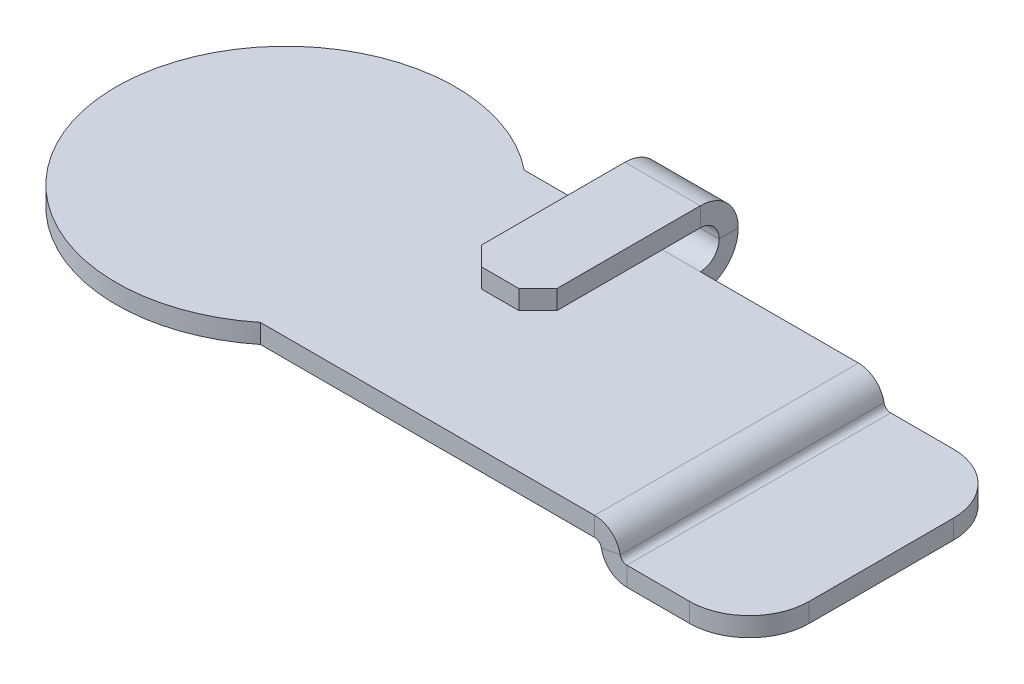
ISO-10303-21;
HEADER;
FILE_DESCRIPTION(('STEP AP214'),'2;1');
FILE_NAME('part.step','',(''),(''),'','','');
FILE_SCHEMA(('AUTOMOTIVE_DESIGN { 1 0 10303 214 1 1 1 1 }'));
ENDSEC;
DATA;
#1=APPLICATION_CONTEXT('core data for automotive mechanical design processes');
#2=APPLICATION_PROTOCOL_DEFINITION('international standard','automotive_design',2000,#1);
#3=PRODUCT_CONTEXT('',#1,'mechanical');
#4=PRODUCT('Part','Part','',(#3));
#5=PRODUCT_RELATED_PRODUCT_CATEGORY('part','',(#4));
#6=PRODUCT_DEFINITION_FORMATION('','',#4);
#7=PRODUCT_DEFINITION_CONTEXT('part definition',#1,'design');
#8=PRODUCT_DEFINITION('design','',#6,#7);
#9=PRODUCT_DEFINITION_SHAPE('','',#8);
#10=(LENGTH_UNIT() NAMED_UNIT(*) SI_UNIT(.MILLI.,.METRE.));
#11=(NAMED_UNIT(*) PLANE_ANGLE_UNIT() SI_UNIT($,.RADIAN.));
#12=(NAMED_UNIT(*) SI_UNIT($,.STERADIAN.) SOLID_ANGLE_UNIT());
#13=UNCERTAINTY_MEASURE_WITH_UNIT(LENGTH_MEASURE(1.E-05),#10,'distance_accuracy_value','');
#14=(GEOMETRIC_REPRESENTATION_CONTEXT(3) GLOBAL_UNCERTAINTY_ASSIGNED_CONTEXT((#13)) GLOBAL_UNIT_ASSIGNED_CONTEXT((#10,
#11,#12)) REPRESENTATION_CONTEXT('',''));
#15=CARTESIAN_POINT('',(0.,0.,0.));
#16=DIRECTION('',(0.,0.,1.));
#17=DIRECTION('',(1.,0.,0.));
#18=AXIS2_PLACEMENT_3D('',#15,#16,#17);
#19=CARTESIAN_POINT('',(0.,0.,-4.508));
#20=DIRECTION('',(0.,0.,-1.));
#21=DIRECTION('',(0.,1.,0.));
#22=AXIS2_PLACEMENT_3D('',#19,#20,#21);
#23=PLANE('',#22);
#24=DIRECTION('',(0.,-1.,0.));
#25=VECTOR('',#24,1.);
#26=CARTESIAN_POINT('',(-2.80312500000001,0.,-4.508));
#27=LINE('',#26,#25);
#28=CARTESIAN_POINT('',(-2.80312500000001,1.008,-4.508));
#29=VERTEX_POINT('',#28);
#30=CARTESIAN_POINT('',(-2.80312500000001,1.01580978479832,-4.508));
#31=VERTEX_POINT('',#30);
#32=EDGE_CURVE('E96',#29,#31,#27,.F.);
#33=ORIENTED_EDGE('',*,*,#32,.T.);
#34=DIRECTION('',(1.,0.,0.));
#35=VECTOR('',#34,1.);
#36=CARTESIAN_POINT('',(0.,1.01580978479832,-4.508));
#37=LINE('',#36,#35);
#38=CARTESIAN_POINT('',(-0.803125000000015,1.01580978479832,-4.508));
#39=VERTEX_POINT('',#38);
#40=EDGE_CURVE('E88',#31,#39,#37,.T.);
#41=ORIENTED_EDGE('',*,*,#40,.T.);
#42=DIRECTION('',(0.,1.,0.));
#43=VECTOR('',#42,1.);
#44=CARTESIAN_POINT('',(-0.803125000000016,0.,-4.508));
#45=LINE('',#44,#43);
#46=CARTESIAN_POINT('',(-0.803125000000015,1.00799999999999,-4.508));
#47=VERTEX_POINT('',#46);
#48=EDGE_CURVE('E104',#39,#47,#45,.F.);
#49=ORIENTED_EDGE('',*,*,#48,.T.);
#50=DIRECTION('',(-1.,0.,0.));
#51=VECTOR('',#50,1.);
#52=CARTESIAN_POINT('',(0.,1.008,-4.508));
#53=LINE('',#52,#51);
#54=EDGE_CURVE('E429',#47,#29,#53,.T.);
#55=ORIENTED_EDGE('',*,*,#54,.T.);
#56=EDGE_LOOP('',(#33,#41,#49,#55));
#57=FACE_BOUND('',#56,.T.);
#58=ADVANCED_FACE('F79',(#57),#23,.T.);
#59=CARTESIAN_POINT('',(7.5,0.508,-3.5));
#60=DIRECTION('',(0.,0.,-1.));
#61=DIRECTION('',(-1.,0.,0.));
#62=AXIS2_PLACEMENT_3D('',#59,#60,#61);
#63=PLANE('',#62);
#64=DIRECTION('',(-1.,0.,0.));
#65=VECTOR('',#64,1.);
#66=CARTESIAN_POINT('',(7.5,0.508,-3.5));
#67=LINE('',#66,#65);
#68=CARTESIAN_POINT('',(3.39388584185377,0.508,-3.5));
#69=VERTEX_POINT('',#68);
#70=CARTESIAN_POINT('',(-0.803125000000015,0.507999999999994,-3.5));
#71=VERTEX_POINT('',#70);
#72=EDGE_CURVE('E450',#69,#71,#67,.T.);
#73=ORIENTED_EDGE('',*,*,#72,.F.);
#74=DIRECTION('',(0.,-1.,0.));
#75=VECTOR('',#74,1.);
#76=CARTESIAN_POINT('',(3.39388584185377,0.508,-3.5));
#77=LINE('',#76,#75);
#78=CARTESIAN_POINT('',(3.39388584185377,0.,-3.5));
#79=VERTEX_POINT('',#78);
#80=EDGE_CURVE('E440',#69,#79,#77,.T.);
#81=ORIENTED_EDGE('',*,*,#80,.T.);
#82=DIRECTION('',(1.,0.,0.));
#83=VECTOR('',#82,1.);
#84=CARTESIAN_POINT('',(0.,0.,-3.5));
#85=LINE('',#84,#83);
#86=CARTESIAN_POINT('',(-0.803125000000015,0.,-3.5));
#87=VERTEX_POINT('',#86);
#88=EDGE_CURVE('E381',#79,#87,#85,.F.);
#89=ORIENTED_EDGE('',*,*,#88,.T.);
#90=DIRECTION('',(0.,-1.,0.));
#91=VECTOR('',#90,1.);
#92=CARTESIAN_POINT('',(-0.803125000000015,0.507999999999994,-3.5));
#93=LINE('',#92,#91);
#94=EDGE_CURVE('E387',#71,#87,#93,.T.);
#95=ORIENTED_EDGE('',*,*,#94,.F.);
#96=EDGE_LOOP('',(#73,#81,#89,#95));
#97=FACE_BOUND('',#96,.T.);
#98=ADVANCED_FACE('F569',(#97),#63,.T.);
#99=CARTESIAN_POINT('',(7.5,0.508,3.5));
#100=DIRECTION('',(0.,0.,1.));
#101=DIRECTION('',(1.,0.,0.));
#102=AXIS2_PLACEMENT_3D('',#99,#100,#101);
#103=PLANE('',#102);
#104=DIRECTION('',(1.,0.,0.));
#105=VECTOR('',#104,1.);
#106=CARTESIAN_POINT('',(0.,0.,3.5));
#107=LINE('',#106,#105);
#108=CARTESIAN_POINT('',(-5.47469787525383,0.,3.5));
#109=VERTEX_POINT('',#108);
#110=CARTESIAN_POINT('',(3.39388584185377,0.,3.5));
#111=VERTEX_POINT('',#110);
#112=EDGE_CURVE('E445',#109,#111,#107,.T.);
#113=ORIENTED_EDGE('',*,*,#112,.T.);
#114=DIRECTION('',(0.,1.,0.));
#115=VECTOR('',#114,1.);
#116=CARTESIAN_POINT('',(3.39388584185377,0.508,3.5));
#117=LINE('',#116,#115);
#118=CARTESIAN_POINT('',(3.39388584185377,0.508,3.5));
#119=VERTEX_POINT('',#118);
#120=EDGE_CURVE('E434',#111,#119,#117,.T.);
#121=ORIENTED_EDGE('',*,*,#120,.T.);
#122=DIRECTION('',(1.,0.,0.));
#123=VECTOR('',#122,1.);
#124=CARTESIAN_POINT('',(7.5,0.508,3.5));
#125=LINE('',#124,#123);
#126=CARTESIAN_POINT('',(-5.47469787525383,0.508,3.5));
#127=VERTEX_POINT('',#126);
#128=EDGE_CURVE('E448',#127,#119,#125,.T.);
#129=ORIENTED_EDGE('',*,*,#128,.F.);
#130=DIRECTION('',(0.,1.,0.));
#131=VECTOR('',#130,1.);
#132=CARTESIAN_POINT('',(-5.47469787525383,0.508,3.5));
#133=LINE('',#132,#131);
#134=EDGE_CURVE('E385',#109,#127,#133,.T.);
#135=ORIENTED_EDGE('',*,*,#134,.F.);
#136=EDGE_LOOP('',(#113,#121,#129,#135));
#137=FACE_BOUND('',#136,.T.);
#138=ADVANCED_FACE('F513',(#137),#103,.T.);
#139=CARTESIAN_POINT('',(0.,0.508,0.));
#140=DIRECTION('',(0.,1.,0.));
#141=DIRECTION('',(0.,0.,1.));
#142=AXIS2_PLACEMENT_3D('',#139,#140,#141);
#143=PLANE('',#142);
#144=ORIENTED_EDGE('',*,*,#128,.T.);
#145=DIRECTION('',(0.,0.,-1.));
#146=VECTOR('',#145,1.);
#147=CARTESIAN_POINT('',(3.39388584185377,0.508,0.));
#148=LINE('',#147,#146);
#149=EDGE_CURVE('E431',#119,#69,#148,.T.);
#150=ORIENTED_EDGE('',*,*,#149,.T.);
#151=ORIENTED_EDGE('',*,*,#72,.T.);
#152=DIRECTION('',(-1.,0.,0.));
#153=VECTOR('',#152,1.);
#154=CARTESIAN_POINT('',(-2.80312500000001,0.507999999999994,-3.5));
#155=LINE('',#154,#153);
#156=CARTESIAN_POINT('',(-2.80312500000001,0.507999999999994,-3.5));
#157=VERTEX_POINT('',#156);
#158=EDGE_CURVE('E411',#157,#71,#155,.F.);
#159=ORIENTED_EDGE('',*,*,#158,.F.);
#160=CARTESIAN_POINT('',(-5.47469787525382,0.508,-3.5));
#161=VERTEX_POINT('',#160);
#162=EDGE_CURVE('E399',#157,#161,#67,.T.);
#163=ORIENTED_EDGE('',*,*,#162,.T.);
#164=CARTESIAN_POINT('',(-8.30312500000002,0.508,0.));
#165=DIRECTION('',(0.,1.,0.));
#166=DIRECTION('',(0.,0.,1.));
#167=AXIS2_PLACEMENT_3D('',#164,#165,#166);
#168=CIRCLE('',#167,4.5);
#169=EDGE_CURVE('E395',#161,#127,#168,.T.);
#170=ORIENTED_EDGE('',*,*,#169,.T.);
#171=EDGE_LOOP('',(#144,#150,#151,#159,#163,#170));
#172=FACE_BOUND('',#171,.T.);
#173=ADVANCED_FACE('F511',(#172),#143,.T.);
#174=CARTESIAN_POINT('',(0.,0.,0.));
#175=DIRECTION('',(0.,1.,0.));
#176=DIRECTION('',(0.,0.,1.));
#177=AXIS2_PLACEMENT_3D('',#174,#175,#176);
#178=PLANE('',#177);
#179=DIRECTION('',(0.,0.,-1.));
#180=VECTOR('',#179,1.);
#181=CARTESIAN_POINT('',(3.39388584185377,0.,0.));
#182=LINE('',#181,#180);
#183=EDGE_CURVE('E437',#111,#79,#182,.T.);
#184=ORIENTED_EDGE('',*,*,#183,.F.);
#185=ORIENTED_EDGE('',*,*,#112,.F.);
#186=CARTESIAN_POINT('',(-8.30312500000002,0.,0.));
#187=DIRECTION('',(0.,1.,0.));
#188=DIRECTION('',(0.,0.,1.));
#189=AXIS2_PLACEMENT_3D('',#186,#187,#188);
#190=CIRCLE('',#189,4.5);
#191=CARTESIAN_POINT('',(-5.47469787525383,0.,-3.5));
#192=VERTEX_POINT('',#191);
#193=EDGE_CURVE('E388',#192,#109,#190,.T.);
#194=ORIENTED_EDGE('',*,*,#193,.F.);
#195=CARTESIAN_POINT('',(-2.80312500000001,0.,-3.5));
#196=VERTEX_POINT('',#195);
#197=EDGE_CURVE('E392',#196,#192,#85,.F.);
#198=ORIENTED_EDGE('',*,*,#197,.F.);
#199=DIRECTION('',(-1.,0.,0.));
#200=VECTOR('',#199,1.);
#201=CARTESIAN_POINT('',(-2.80312500000002,0.,-3.5));
#202=LINE('',#201,#200);
#203=EDGE_CURVE('E398',#196,#87,#202,.F.);
#204=ORIENTED_EDGE('',*,*,#203,.T.);
#205=ORIENTED_EDGE('',*,*,#88,.F.);
#206=EDGE_LOOP('',(#184,#185,#194,#198,#204,#205));
#207=FACE_BOUND('',#206,.T.);
#208=ADVANCED_FACE('F503',(#207),#178,.F.);
#209=ORIENTED_EDGE('',*,*,#162,.F.);
#210=DIRECTION('',(0.,-1.,0.));
#211=VECTOR('',#210,1.);
#212=CARTESIAN_POINT('',(-2.80312500000001,0.507999999999994,-3.5));
#213=LINE('',#212,#211);
#214=EDGE_CURVE('E400',#157,#196,#213,.T.);
#215=ORIENTED_EDGE('',*,*,#214,.T.);
#216=ORIENTED_EDGE('',*,*,#197,.T.);
#217=DIRECTION('',(0.,1.,0.));
#218=VECTOR('',#217,1.);
#219=CARTESIAN_POINT('',(-5.47469787525382,0.508,-3.5));
#220=LINE('',#219,#218);
#221=EDGE_CURVE('E389',#192,#161,#220,.T.);
#222=ORIENTED_EDGE('',*,*,#221,.T.);
#223=EDGE_LOOP('',(#209,#215,#216,#222));
#224=FACE_BOUND('',#223,.T.);
#225=ADVANCED_FACE('F497',(#224),#63,.T.);
#226=CARTESIAN_POINT('',(-8.30312500000002,0.508,0.));
#227=DIRECTION('',(0.,1.,0.));
#228=DIRECTION('',(0.,0.,1.));
#229=AXIS2_PLACEMENT_3D('',#226,#227,#228);
#230=CYLINDRICAL_SURFACE('',#229,4.5);
#231=ORIENTED_EDGE('',*,*,#221,.F.);
#232=ORIENTED_EDGE('',*,*,#193,.T.);
#233=ORIENTED_EDGE('',*,*,#134,.T.);
#234=ORIENTED_EDGE('',*,*,#169,.F.);
#235=EDGE_LOOP('',(#231,#232,#233,#234));
#236=FACE_BOUND('',#235,.T.);
#237=ADVANCED_FACE('F507',(#236),#230,.T.);
#238=CARTESIAN_POINT('',(-0.803125000000015,1.00799999999999,-3.5));
#239=DIRECTION('',(1.,0.,0.));
#240=DIRECTION('',(0.,1.,0.));
#241=AXIS2_PLACEMENT_3D('',#238,#239,#240);
#242=PLANE('',#241);
#243=DIRECTION('',(0.,0.,1.));
#244=VECTOR('',#243,1.);
#245=CARTESIAN_POINT('',(-0.803125000000015,1.008,-4.50800000000006));
#246=LINE('',#245,#244);
#247=CARTESIAN_POINT('',(-0.803125000000015,1.00799999999999,-4.));
#248=VERTEX_POINT('',#247);
#249=EDGE_CURVE('E424',#248,#47,#246,.F.);
#250=ORIENTED_EDGE('',*,*,#249,.F.);
#251=CARTESIAN_POINT('',(-0.803125000000015,1.00799999999999,-3.5));
#252=DIRECTION('',(-1.,0.,0.));
#253=DIRECTION('',(0.,-1.,0.));
#254=AXIS2_PLACEMENT_3D('',#251,#252,#253);
#255=CIRCLE('',#254,0.5);
#256=EDGE_CURVE('E414',#71,#248,#255,.F.);
#257=ORIENTED_EDGE('',*,*,#256,.F.);
#258=ORIENTED_EDGE('',*,*,#94,.T.);
#259=CARTESIAN_POINT('',(-0.803125000000015,1.00799999999999,-3.5));
#260=DIRECTION('',(-1.,0.,0.));
#261=DIRECTION('',(0.,-1.,0.));
#262=AXIS2_PLACEMENT_3D('',#259,#260,#261);
#263=CIRCLE('',#262,1.008);
#264=EDGE_CURVE('E405',#87,#47,#263,.F.);
#265=ORIENTED_EDGE('',*,*,#264,.T.);
#266=EDGE_LOOP('',(#250,#257,#258,#265));
#267=FACE_BOUND('',#266,.T.);
#268=ADVANCED_FACE('F479',(#267),#242,.T.);
#269=CARTESIAN_POINT('',(-2.80312500000001,1.00799999999999,-3.5));
#270=DIRECTION('',(1.,0.,0.));
#271=DIRECTION('',(0.,1.,0.));
#272=AXIS2_PLACEMENT_3D('',#269,#270,#271);
#273=PLANE('',#272);
#274=CARTESIAN_POINT('',(-2.80312500000001,1.00799999999999,-3.5));
#275=DIRECTION('',(-1.,0.,0.));
#276=DIRECTION('',(0.,-1.,0.));
#277=AXIS2_PLACEMENT_3D('',#274,#275,#276);
#278=CIRCLE('',#277,0.5);
#279=CARTESIAN_POINT('',(-2.80312500000001,1.00799999999999,-4.));
#280=VERTEX_POINT('',#279);
#281=EDGE_CURVE('E406',#280,#157,#278,.T.);
#282=ORIENTED_EDGE('',*,*,#281,.F.);
#283=DIRECTION('',(0.,0.,1.));
#284=VECTOR('',#283,1.);
#285=CARTESIAN_POINT('',(-2.80312500000001,1.008,-4.));
#286=LINE('',#285,#284);
#287=EDGE_CURVE('E419',#280,#29,#286,.F.);
#288=ORIENTED_EDGE('',*,*,#287,.T.);
#289=CARTESIAN_POINT('',(-2.80312500000001,1.00799999999999,-3.5));
#290=DIRECTION('',(-1.,0.,0.));
#291=DIRECTION('',(0.,-1.,0.));
#292=AXIS2_PLACEMENT_3D('',#289,#290,#291);
#293=CIRCLE('',#292,1.008);
#294=EDGE_CURVE('E415',#29,#196,#293,.T.);
#295=ORIENTED_EDGE('',*,*,#294,.T.);
#296=ORIENTED_EDGE('',*,*,#214,.F.);
#297=EDGE_LOOP('',(#282,#288,#295,#296));
#298=FACE_BOUND('',#297,.T.);
#299=ADVANCED_FACE('F494',(#298),#273,.F.);
#300=CARTESIAN_POINT('',(-2.80312500000001,1.00799999999999,-3.5));
#301=DIRECTION('',(-1.,0.,0.));
#302=DIRECTION('',(0.,0.,-1.));
#303=AXIS2_PLACEMENT_3D('',#300,#301,#302);
#304=CYLINDRICAL_SURFACE('',#303,1.008);
#305=ORIENTED_EDGE('',*,*,#203,.F.);
#306=ORIENTED_EDGE('',*,*,#294,.F.);
#307=ORIENTED_EDGE('',*,*,#54,.F.);
#308=ORIENTED_EDGE('',*,*,#264,.F.);
#309=EDGE_LOOP('',(#305,#306,#307,#308));
#310=FACE_BOUND('',#309,.T.);
#311=ADVANCED_FACE('F476',(#310),#304,.T.);
#312=CARTESIAN_POINT('',(-2.80312500000001,1.00799999999999,-3.5));
#313=DIRECTION('',(-1.,0.,0.));
#314=DIRECTION('',(0.,0.,-1.));
#315=AXIS2_PLACEMENT_3D('',#312,#313,#314);
#316=CYLINDRICAL_SURFACE('',#315,0.5);
#317=ORIENTED_EDGE('',*,*,#158,.T.);
#318=ORIENTED_EDGE('',*,*,#256,.T.);
#319=DIRECTION('',(1.,0.,0.));
#320=VECTOR('',#319,1.);
#321=CARTESIAN_POINT('',(-0.803125000000015,1.008,-4.));
#322=LINE('',#321,#320);
#323=EDGE_CURVE('E410',#248,#280,#322,.F.);
#324=ORIENTED_EDGE('',*,*,#323,.T.);
#325=ORIENTED_EDGE('',*,*,#281,.T.);
#326=EDGE_LOOP('',(#317,#318,#324,#325));
#327=FACE_BOUND('',#326,.T.);
#328=ADVANCED_FACE('F491',(#327),#316,.F.);
#329=CARTESIAN_POINT('',(-2.80312500000001,0.507999999999998,-4.508));
#330=DIRECTION('',(1.,0.,0.));
#331=DIRECTION('',(0.,0.,-1.));
#332=AXIS2_PLACEMENT_3D('',#329,#330,#331);
#333=PLANE('',#332);
#334=DIRECTION('',(0.,0.,1.));
#335=VECTOR('',#334,1.);
#336=CARTESIAN_POINT('',(-2.80312500000001,1.01580978479832,-4.50799999999999));
#337=LINE('',#336,#335);
#338=CARTESIAN_POINT('',(-2.80312500000001,1.01580978479832,-4.));
#339=VERTEX_POINT('',#338);
#340=EDGE_CURVE('E13',#31,#339,#337,.T.);
#341=ORIENTED_EDGE('',*,*,#340,.F.);
#342=ORIENTED_EDGE('',*,*,#32,.F.);
#343=ORIENTED_EDGE('',*,*,#287,.F.);
#344=DIRECTION('',(0.,1.,0.));
#345=VECTOR('',#344,1.);
#346=CARTESIAN_POINT('',(-2.80312500000001,0.508,-4.));
#347=LINE('',#346,#345);
#348=EDGE_CURVE('E409',#280,#339,#347,.T.);
#349=ORIENTED_EDGE('',*,*,#348,.T.);
#350=EDGE_LOOP('',(#341,#342,#343,#349));
#351=FACE_BOUND('',#350,.T.);
#352=ADVANCED_FACE('F81',(#351),#333,.F.);
#353=CARTESIAN_POINT('',(-0.803125000000015,6.508,-4.50800000000002));
#354=DIRECTION('',(-1.,0.,0.));
#355=DIRECTION('',(0.,0.,1.));
#356=AXIS2_PLACEMENT_3D('',#353,#354,#355);
#357=PLANE('',#356);
#358=DIRECTION('',(0.,0.,-1.));
#359=VECTOR('',#358,1.);
#360=CARTESIAN_POINT('',(-0.803125000000015,1.01580978479832,-4.50800000000006));
#361=LINE('',#360,#359);
#362=CARTESIAN_POINT('',(-0.803125000000015,1.01580978479832,-4.));
#363=VERTEX_POINT('',#362);
#364=EDGE_CURVE('E466',#363,#39,#361,.T.);
#365=ORIENTED_EDGE('',*,*,#364,.F.);
#366=DIRECTION('',(0.,-1.,0.));
#367=VECTOR('',#366,1.);
#368=CARTESIAN_POINT('',(-0.803125000000015,6.508,-4.00000000000002));
#369=LINE('',#368,#367);
#370=EDGE_CURVE('E83',#363,#248,#369,.T.);
#371=ORIENTED_EDGE('',*,*,#370,.T.);
#372=ORIENTED_EDGE('',*,*,#249,.T.);
#373=ORIENTED_EDGE('',*,*,#48,.F.);
#374=EDGE_LOOP('',(#365,#371,#372,#373));
#375=FACE_BOUND('',#374,.T.);
#376=ADVANCED_FACE('F482',(#375),#357,.F.);
#377=CARTESIAN_POINT('',(0.,0.,-4.));
#378=DIRECTION('',(0.,0.,-1.));
#379=DIRECTION('',(0.,1.,0.));
#380=AXIS2_PLACEMENT_3D('',#377,#378,#379);
#381=PLANE('',#380);
#382=DIRECTION('',(1.,0.,0.));
#383=VECTOR('',#382,1.);
#384=CARTESIAN_POINT('',(0.,1.01580978479832,-4.));
#385=LINE('',#384,#383);
#386=EDGE_CURVE('E463',#339,#363,#385,.T.);
#387=ORIENTED_EDGE('',*,*,#386,.F.);
#388=ORIENTED_EDGE('',*,*,#348,.F.);
#389=ORIENTED_EDGE('',*,*,#323,.F.);
#390=ORIENTED_EDGE('',*,*,#370,.F.);
#391=EDGE_LOOP('',(#387,#388,#389,#390));
#392=FACE_BOUND('',#391,.T.);
#393=ADVANCED_FACE('F486',(#392),#381,.F.);
#394=CARTESIAN_POINT('',(3.39388584185377,-0.18,3.5));
#395=DIRECTION('',(0.,0.,1.));
#396=DIRECTION('',(1.,0.,0.));
#397=AXIS2_PLACEMENT_3D('',#394,#395,#396);
#398=PLANE('',#397);
#399=ORIENTED_EDGE('',*,*,#120,.F.);
#400=CARTESIAN_POINT('',(3.39388584185377,-0.18,3.5));
#401=DIRECTION('',(0.,0.,-1.));
#402=DIRECTION('',(-1.,0.,0.));
#403=AXIS2_PLACEMENT_3D('',#400,#401,#402);
#404=CIRCLE('',#403,0.18);
#405=CARTESIAN_POINT('',(3.57115123739597,-0.148743328019961,3.5));
#406=VERTEX_POINT('',#405);
#407=EDGE_CURVE('E369',#111,#406,#404,.T.);
#408=ORIENTED_EDGE('',*,*,#407,.T.);
#409=DIRECTION('',(0.984807753012209,0.173648177666924,0.));
#410=VECTOR('',#409,1.);
#411=CARTESIAN_POINT('',(4.07143357592617,-0.0605300537651543,3.5));
#412=LINE('',#411,#410);
#413=CARTESIAN_POINT('',(4.07143357592617,-0.0605300537651562,3.5));
#414=VERTEX_POINT('',#413);
#415=EDGE_CURVE('E455',#406,#414,#412,.T.);
#416=ORIENTED_EDGE('',*,*,#415,.T.);
#417=CARTESIAN_POINT('',(3.39388584185377,-0.18,3.5));
#418=DIRECTION('',(0.,0.,-1.));
#419=DIRECTION('',(-1.,0.,0.));
#420=AXIS2_PLACEMENT_3D('',#417,#418,#419);
#421=CIRCLE('',#420,0.688);
#422=EDGE_CURVE('E374',#119,#414,#421,.T.);
#423=ORIENTED_EDGE('',*,*,#422,.F.);
#424=EDGE_LOOP('',(#399,#408,#416,#423));
#425=FACE_BOUND('',#424,.T.);
#426=ADVANCED_FACE('F517',(#425),#398,.T.);
#427=CARTESIAN_POINT('',(3.39388584185377,-0.18,-3.5));
#428=DIRECTION('',(0.,0.,-1.));
#429=DIRECTION('',(-1.,0.,0.));
#430=AXIS2_PLACEMENT_3D('',#427,#428,#429);
#431=PLANE('',#430);
#432=CARTESIAN_POINT('',(3.39388584185377,-0.18,-3.5));
#433=DIRECTION('',(0.,0.,-1.));
#434=DIRECTION('',(-1.,0.,0.));
#435=AXIS2_PLACEMENT_3D('',#432,#433,#434);
#436=CIRCLE('',#435,0.18);
#437=CARTESIAN_POINT('',(3.57115123739597,-0.148743328019952,-3.5));
#438=VERTEX_POINT('',#437);
#439=EDGE_CURVE('E378',#438,#79,#436,.F.);
#440=ORIENTED_EDGE('',*,*,#439,.T.);
#441=ORIENTED_EDGE('',*,*,#80,.F.);
#442=CARTESIAN_POINT('',(3.39388584185377,-0.18,-3.5));
#443=DIRECTION('',(0.,0.,1.));
#444=DIRECTION('',(1.,0.,0.));
#445=AXIS2_PLACEMENT_3D('',#442,#443,#444);
#446=CIRCLE('',#445,0.688);
#447=CARTESIAN_POINT('',(4.07143357592617,-0.0605300537651575,-3.5));
#448=VERTEX_POINT('',#447);
#449=EDGE_CURVE('E377',#448,#69,#446,.T.);
#450=ORIENTED_EDGE('',*,*,#449,.F.);
#451=DIRECTION('',(-0.984807753012209,-0.173648177666924,0.));
#452=VECTOR('',#451,1.);
#453=CARTESIAN_POINT('',(4.07143357592617,-0.0605300537651543,-3.5));
#454=LINE('',#453,#452);
#455=EDGE_CURVE('E460',#448,#438,#454,.T.);
#456=ORIENTED_EDGE('',*,*,#455,.T.);
#457=EDGE_LOOP('',(#440,#441,#450,#456));
#458=FACE_BOUND('',#457,.T.);
#459=ADVANCED_FACE('F599',(#458),#431,.T.);
#460=CARTESIAN_POINT('',(3.39388584185377,-0.18,7.04452082968151));
#461=DIRECTION('',(0.,0.,-1.));
#462=DIRECTION('',(-1.,0.,0.));
#463=AXIS2_PLACEMENT_3D('',#460,#461,#462);
#464=CYLINDRICAL_SURFACE('',#463,0.688);
#465=DIRECTION('',(0.,0.,-1.));
#466=VECTOR('',#465,1.);
#467=CARTESIAN_POINT('',(4.07143357592617,-0.0605300537651547,0.));
#468=LINE('',#467,#466);
#469=EDGE_CURVE('E443',#414,#448,#468,.T.);
#470=ORIENTED_EDGE('',*,*,#469,.T.);
#471=ORIENTED_EDGE('',*,*,#449,.T.);
#472=ORIENTED_EDGE('',*,*,#149,.F.);
#473=ORIENTED_EDGE('',*,*,#422,.T.);
#474=EDGE_LOOP('',(#470,#471,#472,#473));
#475=FACE_BOUND('',#474,.T.);
#476=ADVANCED_FACE('F602',(#475),#464,.T.);
#477=CARTESIAN_POINT('',(3.39388584185377,-0.18,7.04452082968151));
#478=DIRECTION('',(0.,0.,-1.));
#479=DIRECTION('',(-1.,0.,0.));
#480=AXIS2_PLACEMENT_3D('',#477,#478,#479);
#481=CYLINDRICAL_SURFACE('',#480,0.18);
#482=DIRECTION('',(0.,0.,-1.));
#483=VECTOR('',#482,1.);
#484=CARTESIAN_POINT('',(3.57115123739597,-0.148743328019952,0.));
#485=LINE('',#484,#483);
#486=EDGE_CURVE('E458',#406,#438,#485,.T.);
#487=ORIENTED_EDGE('',*,*,#486,.F.);
#488=ORIENTED_EDGE('',*,*,#407,.F.);
#489=ORIENTED_EDGE('',*,*,#183,.T.);
#490=ORIENTED_EDGE('',*,*,#439,.F.);
#491=EDGE_LOOP('',(#487,#488,#489,#490));
#492=FACE_BOUND('',#491,.T.);
#493=ADVANCED_FACE('F520',(#492),#481,.F.);
#494=CARTESIAN_POINT('',(4.24869897146837,-0.0292733817851084,3.5));
#495=DIRECTION('',(0.,0.,-1.));
#496=DIRECTION('',(-1.,0.,0.));
#497=AXIS2_PLACEMENT_3D('',#494,#495,#496);
#498=PLANE('',#497);
#499=ORIENTED_EDGE('',*,*,#415,.F.);
#500=CARTESIAN_POINT('',(4.24869897146837,-0.0292733817851084,3.5));
#501=DIRECTION('',(0.,0.,-1.));
#502=DIRECTION('',(-1.,0.,0.));
#503=AXIS2_PLACEMENT_3D('',#500,#501,#502);
#504=CIRCLE('',#503,0.688);
#505=CARTESIAN_POINT('',(4.24869897146837,-0.717273381785107,3.5));
#506=VERTEX_POINT('',#505);
#507=EDGE_CURVE('E315',#406,#506,#504,.F.);
#508=ORIENTED_EDGE('',*,*,#507,.T.);
#509=DIRECTION('',(0.,1.,0.));
#510=VECTOR('',#509,1.);
#511=CARTESIAN_POINT('',(4.24869897146837,-0.209273381785107,3.5));
#512=LINE('',#511,#510);
#513=CARTESIAN_POINT('',(4.24869897146837,-0.209273381785107,3.5));
#514=VERTEX_POINT('',#513);
#515=EDGE_CURVE('E354',#506,#514,#512,.T.);
#516=ORIENTED_EDGE('',*,*,#515,.T.);
#517=CARTESIAN_POINT('',(4.24869897146837,-0.0292733817851084,3.5));
#518=DIRECTION('',(0.,0.,1.));
#519=DIRECTION('',(1.,0.,0.));
#520=AXIS2_PLACEMENT_3D('',#517,#518,#519);
#521=CIRCLE('',#520,0.18);
#522=EDGE_CURVE('E362',#414,#514,#521,.T.);
#523=ORIENTED_EDGE('',*,*,#522,.F.);
#524=EDGE_LOOP('',(#499,#508,#516,#523));
#525=FACE_BOUND('',#524,.T.);
#526=ADVANCED_FACE('F541',(#525),#498,.F.);
#527=CARTESIAN_POINT('',(4.24869897146837,-0.0292733817851084,-3.5));
#528=DIRECTION('',(0.,0.,1.));
#529=DIRECTION('',(1.,0.,0.));
#530=AXIS2_PLACEMENT_3D('',#527,#528,#529);
#531=PLANE('',#530);
#532=DIRECTION('',(0.,-1.,0.));
#533=VECTOR('',#532,1.);
#534=CARTESIAN_POINT('',(4.24869897146837,-0.209273381785108,-3.5));
#535=LINE('',#534,#533);
#536=CARTESIAN_POINT('',(4.24869897146837,-0.209273381785108,-3.5));
#537=VERTEX_POINT('',#536);
#538=CARTESIAN_POINT('',(4.24869897146837,-0.717273381785107,-3.5));
#539=VERTEX_POINT('',#538);
#540=EDGE_CURVE('E357',#537,#539,#535,.T.);
#541=ORIENTED_EDGE('',*,*,#540,.T.);
#542=CARTESIAN_POINT('',(4.24869897146837,-0.0292733817851084,-3.49999999999999));
#543=DIRECTION('',(0.,0.,-1.));
#544=DIRECTION('',(-1.,0.,0.));
#545=AXIS2_PLACEMENT_3D('',#542,#543,#544);
#546=CIRCLE('',#545,0.688);
#547=EDGE_CURVE('E366',#539,#438,#546,.T.);
#548=ORIENTED_EDGE('',*,*,#547,.T.);
#549=ORIENTED_EDGE('',*,*,#455,.F.);
#550=CARTESIAN_POINT('',(4.24869897146837,-0.0292733817851084,-3.5));
#551=DIRECTION('',(0.,0.,-1.));
#552=DIRECTION('',(-1.,0.,0.));
#553=AXIS2_PLACEMENT_3D('',#550,#551,#552);
#554=CIRCLE('',#553,0.18);
#555=EDGE_CURVE('E365',#537,#448,#554,.T.);
#556=ORIENTED_EDGE('',*,*,#555,.F.);
#557=EDGE_LOOP('',(#541,#548,#549,#556));
#558=FACE_BOUND('',#557,.T.);
#559=ADVANCED_FACE('F528',(#558),#531,.F.);
#560=CARTESIAN_POINT('',(4.24869897146837,-0.0292733817851084,7.05945087234529));
#561=DIRECTION('',(0.,0.,-1.));
#562=DIRECTION('',(-1.,0.,0.));
#563=AXIS2_PLACEMENT_3D('',#560,#561,#562);
#564=CYLINDRICAL_SURFACE('',#563,0.18);
#565=ORIENTED_EDGE('',*,*,#555,.T.);
#566=ORIENTED_EDGE('',*,*,#469,.F.);
#567=ORIENTED_EDGE('',*,*,#522,.T.);
#568=DIRECTION('',(0.,0.,-1.));
#569=VECTOR('',#568,1.);
#570=CARTESIAN_POINT('',(4.24869897146837,-0.209273381785107,0.));
#571=LINE('',#570,#569);
#572=EDGE_CURVE('E310',#514,#537,#571,.T.);
#573=ORIENTED_EDGE('',*,*,#572,.T.);
#574=EDGE_LOOP('',(#565,#566,#567,#573));
#575=FACE_BOUND('',#574,.T.);
#576=ADVANCED_FACE('F538',(#575),#564,.F.);
#577=CARTESIAN_POINT('',(4.24869897146837,-0.0292733817851084,7.05945087234529));
#578=DIRECTION('',(0.,0.,-1.));
#579=DIRECTION('',(-1.,0.,0.));
#580=AXIS2_PLACEMENT_3D('',#577,#578,#579);
#581=CYLINDRICAL_SURFACE('',#580,0.688);
#582=ORIENTED_EDGE('',*,*,#547,.F.);
#583=DIRECTION('',(0.,0.,-1.));
#584=VECTOR('',#583,1.);
#585=CARTESIAN_POINT('',(4.24869897146837,-0.717273381785107,0.));
#586=LINE('',#585,#584);
#587=EDGE_CURVE('E316',#506,#539,#586,.T.);
#588=ORIENTED_EDGE('',*,*,#587,.F.);
#589=ORIENTED_EDGE('',*,*,#507,.F.);
#590=ORIENTED_EDGE('',*,*,#486,.T.);
#591=EDGE_LOOP('',(#582,#588,#589,#590));
#592=FACE_BOUND('',#591,.T.);
#593=ADVANCED_FACE('F525',(#592),#581,.T.);
#594=CARTESIAN_POINT('',(5.9125,-0.209273381785107,-1.9125));
#595=DIRECTION('',(0.,1.,0.));
#596=DIRECTION('',(0.,0.,1.));
#597=AXIS2_PLACEMENT_3D('',#594,#595,#596);
#598=CYLINDRICAL_SURFACE('',#597,1.5875);
#599=DIRECTION('',(0.,1.,0.));
#600=VECTOR('',#599,1.);
#601=CARTESIAN_POINT('',(7.5,-0.209273381785108,-1.9125));
#602=LINE('',#601,#600);
#603=CARTESIAN_POINT('',(7.5,-0.717273381785107,-1.9125));
#604=VERTEX_POINT('',#603);
#605=CARTESIAN_POINT('',(7.5,-0.209273381785108,-1.9125));
#606=VERTEX_POINT('',#605);
#607=EDGE_CURVE('E343',#604,#606,#602,.T.);
#608=ORIENTED_EDGE('',*,*,#607,.F.);
#609=CARTESIAN_POINT('',(5.9125,-0.717273381785107,-1.9125));
#610=DIRECTION('',(0.,1.,0.));
#611=DIRECTION('',(0.,0.,1.));
#612=AXIS2_PLACEMENT_3D('',#609,#610,#611);
#613=CIRCLE('',#612,1.5875);
#614=CARTESIAN_POINT('',(5.9125,-0.717273381785107,-3.5));
#615=VERTEX_POINT('',#614);
#616=EDGE_CURVE('E351',#604,#615,#613,.T.);
#617=ORIENTED_EDGE('',*,*,#616,.T.);
#618=DIRECTION('',(0.,1.,0.));
#619=VECTOR('',#618,1.);
#620=CARTESIAN_POINT('',(5.9125,-0.209273381785107,-3.5));
#621=LINE('',#620,#619);
#622=CARTESIAN_POINT('',(5.9125,-0.209273381785107,-3.5));
#623=VERTEX_POINT('',#622);
#624=EDGE_CURVE('E348',#615,#623,#621,.T.);
#625=ORIENTED_EDGE('',*,*,#624,.T.);
#626=CARTESIAN_POINT('',(5.9125,-0.209273381785107,-1.9125));
#627=DIRECTION('',(0.,1.,0.));
#628=DIRECTION('',(0.,0.,1.));
#629=AXIS2_PLACEMENT_3D('',#626,#627,#628);
#630=CIRCLE('',#629,1.5875);
#631=EDGE_CURVE('E327',#606,#623,#630,.T.);
#632=ORIENTED_EDGE('',*,*,#631,.F.);
#633=EDGE_LOOP('',(#608,#617,#625,#632));
#634=FACE_BOUND('',#633,.T.);
#635=ADVANCED_FACE('F558',(#634),#598,.T.);
#636=CARTESIAN_POINT('',(7.5,-0.209273381785106,3.5));
#637=DIRECTION('',(1.,0.,0.));
#638=DIRECTION('',(0.,0.,-1.));
#639=AXIS2_PLACEMENT_3D('',#636,#637,#638);
#640=PLANE('',#639);
#641=DIRECTION('',(0.,1.,0.));
#642=VECTOR('',#641,1.);
#643=CARTESIAN_POINT('',(7.5,-0.209273381785107,1.9125));
#644=LINE('',#643,#642);
#645=CARTESIAN_POINT('',(7.5,-0.717273381785108,1.9125));
#646=VERTEX_POINT('',#645);
#647=CARTESIAN_POINT('',(7.5,-0.209273381785107,1.9125));
#648=VERTEX_POINT('',#647);
#649=EDGE_CURVE('E338',#646,#648,#644,.T.);
#650=ORIENTED_EDGE('',*,*,#649,.F.);
#651=DIRECTION('',(0.,0.,1.));
#652=VECTOR('',#651,1.);
#653=CARTESIAN_POINT('',(7.5,-0.717273381785107,0.));
#654=LINE('',#653,#652);
#655=EDGE_CURVE('E345',#646,#604,#654,.F.);
#656=ORIENTED_EDGE('',*,*,#655,.T.);
#657=ORIENTED_EDGE('',*,*,#607,.T.);
#658=DIRECTION('',(0.,0.,-1.));
#659=VECTOR('',#658,1.);
#660=CARTESIAN_POINT('',(7.5,-0.209273381785106,3.5));
#661=LINE('',#660,#659);
#662=EDGE_CURVE('E330',#648,#606,#661,.T.);
#663=ORIENTED_EDGE('',*,*,#662,.F.);
#664=EDGE_LOOP('',(#650,#656,#657,#663));
#665=FACE_BOUND('',#664,.T.);
#666=ADVANCED_FACE('F556',(#665),#640,.T.);
#667=CARTESIAN_POINT('',(5.9125,-0.209273381785106,1.9125));
#668=DIRECTION('',(0.,1.,0.));
#669=DIRECTION('',(0.,0.,1.));
#670=AXIS2_PLACEMENT_3D('',#667,#668,#669);
#671=CYLINDRICAL_SURFACE('',#670,1.5875);
#672=DIRECTION('',(0.,1.,0.));
#673=VECTOR('',#672,1.);
#674=CARTESIAN_POINT('',(5.9125,-0.209273381785106,3.5));
#675=LINE('',#674,#673);
#676=CARTESIAN_POINT('',(5.9125,-0.717273381785107,3.5));
#677=VERTEX_POINT('',#676);
#678=CARTESIAN_POINT('',(5.9125,-0.209273381785106,3.5));
#679=VERTEX_POINT('',#678);
#680=EDGE_CURVE('E319',#677,#679,#675,.T.);
#681=ORIENTED_EDGE('',*,*,#680,.F.);
#682=CARTESIAN_POINT('',(5.9125,-0.717273381785107,1.9125));
#683=DIRECTION('',(0.,1.,0.));
#684=DIRECTION('',(0.,0.,1.));
#685=AXIS2_PLACEMENT_3D('',#682,#683,#684);
#686=CIRCLE('',#685,1.5875);
#687=EDGE_CURVE('E340',#677,#646,#686,.T.);
#688=ORIENTED_EDGE('',*,*,#687,.T.);
#689=ORIENTED_EDGE('',*,*,#649,.T.);
#690=CARTESIAN_POINT('',(5.9125,-0.209273381785106,1.9125));
#691=DIRECTION('',(0.,1.,0.));
#692=DIRECTION('',(0.,0.,1.));
#693=AXIS2_PLACEMENT_3D('',#690,#691,#692);
#694=CIRCLE('',#693,1.5875);
#695=EDGE_CURVE('E333',#679,#648,#694,.T.);
#696=ORIENTED_EDGE('',*,*,#695,.F.);
#697=EDGE_LOOP('',(#681,#688,#689,#696));
#698=FACE_BOUND('',#697,.T.);
#699=ADVANCED_FACE('F552',(#698),#671,.T.);
#700=CARTESIAN_POINT('',(-0.357143502970269,-0.209273381785107,0.));
#701=DIRECTION('',(0.,1.,0.));
#702=DIRECTION('',(0.,0.,1.));
#703=AXIS2_PLACEMENT_3D('',#700,#701,#702);
#704=PLANE('',#703);
#705=ORIENTED_EDGE('',*,*,#572,.F.);
#706=DIRECTION('',(1.,0.,0.));
#707=VECTOR('',#706,1.);
#708=CARTESIAN_POINT('',(7.14285649702973,-0.209273381785108,3.5));
#709=LINE('',#708,#707);
#710=EDGE_CURVE('E336',#514,#679,#709,.T.);
#711=ORIENTED_EDGE('',*,*,#710,.T.);
#712=ORIENTED_EDGE('',*,*,#695,.T.);
#713=ORIENTED_EDGE('',*,*,#662,.T.);
#714=ORIENTED_EDGE('',*,*,#631,.T.);
#715=DIRECTION('',(-1.,0.,0.));
#716=VECTOR('',#715,1.);
#717=CARTESIAN_POINT('',(7.14285649702973,-0.209273381785108,-3.5));
#718=LINE('',#717,#716);
#719=EDGE_CURVE('E324',#623,#537,#718,.T.);
#720=ORIENTED_EDGE('',*,*,#719,.T.);
#721=EDGE_LOOP('',(#705,#711,#712,#713,#714,#720));
#722=FACE_BOUND('',#721,.T.);
#723=ADVANCED_FACE('F534',(#722),#704,.T.);
#724=CARTESIAN_POINT('',(7.14285649702973,-0.209273381785108,3.5));
#725=DIRECTION('',(0.,0.,1.));
#726=DIRECTION('',(1.,0.,0.));
#727=AXIS2_PLACEMENT_3D('',#724,#725,#726);
#728=PLANE('',#727);
#729=ORIENTED_EDGE('',*,*,#515,.F.);
#730=DIRECTION('',(1.,0.,0.));
#731=VECTOR('',#730,1.);
#732=CARTESIAN_POINT('',(-0.357143502970269,-0.717273381785107,3.5));
#733=LINE('',#732,#731);
#734=EDGE_CURVE('E322',#506,#677,#733,.T.);
#735=ORIENTED_EDGE('',*,*,#734,.T.);
#736=ORIENTED_EDGE('',*,*,#680,.T.);
#737=ORIENTED_EDGE('',*,*,#710,.F.);
#738=EDGE_LOOP('',(#729,#735,#736,#737));
#739=FACE_BOUND('',#738,.T.);
#740=ADVANCED_FACE('F544',(#739),#728,.T.);
#741=CARTESIAN_POINT('',(-0.357143502970269,-0.717273381785107,0.));
#742=DIRECTION('',(0.,1.,0.));
#743=DIRECTION('',(0.,0.,1.));
#744=AXIS2_PLACEMENT_3D('',#741,#742,#743);
#745=PLANE('',#744);
#746=ORIENTED_EDGE('',*,*,#734,.F.);
#747=ORIENTED_EDGE('',*,*,#587,.T.);
#748=DIRECTION('',(1.,0.,0.));
#749=VECTOR('',#748,1.);
#750=CARTESIAN_POINT('',(-0.357143502970269,-0.717273381785107,-3.5));
#751=LINE('',#750,#749);
#752=EDGE_CURVE('E313',#615,#539,#751,.F.);
#753=ORIENTED_EDGE('',*,*,#752,.F.);
#754=ORIENTED_EDGE('',*,*,#616,.F.);
#755=ORIENTED_EDGE('',*,*,#655,.F.);
#756=ORIENTED_EDGE('',*,*,#687,.F.);
#757=EDGE_LOOP('',(#746,#747,#753,#754,#755,#756));
#758=FACE_BOUND('',#757,.T.);
#759=ADVANCED_FACE('F547',(#758),#745,.F.);
#760=CARTESIAN_POINT('',(7.14285649702973,-0.209273381785108,-3.5));
#761=DIRECTION('',(0.,0.,-1.));
#762=DIRECTION('',(-1.,0.,0.));
#763=AXIS2_PLACEMENT_3D('',#760,#761,#762);
#764=PLANE('',#763);
#765=ORIENTED_EDGE('',*,*,#540,.F.);
#766=ORIENTED_EDGE('',*,*,#719,.F.);
#767=ORIENTED_EDGE('',*,*,#624,.F.);
#768=ORIENTED_EDGE('',*,*,#752,.T.);
#769=EDGE_LOOP('',(#765,#766,#767,#768));
#770=FACE_BOUND('',#769,.T.);
#771=ADVANCED_FACE('F531',(#770),#764,.T.);
#772=CARTESIAN_POINT('',(-2.80312500000001,1.01580978479832,-3.5));
#773=DIRECTION('',(1.,0.,0.));
#774=DIRECTION('',(0.,0.,-1.));
#775=AXIS2_PLACEMENT_3D('',#772,#773,#774);
#776=PLANE('',#775);
#777=DIRECTION('',(0.,-1.,0.));
#778=VECTOR('',#777,1.);
#779=CARTESIAN_POINT('',(-2.80312500000001,2.0238097847983,-3.49999999999999));
#780=LINE('',#779,#778);
#781=CARTESIAN_POINT('',(-2.80312500000001,2.02380978479832,-3.49999999999999));
#782=VERTEX_POINT('',#781);
#783=CARTESIAN_POINT('',(-2.80312500000001,1.51580978479832,-3.5));
#784=VERTEX_POINT('',#783);
#785=EDGE_CURVE('E251',#782,#784,#780,.T.);
#786=ORIENTED_EDGE('',*,*,#785,.F.);
#787=CARTESIAN_POINT('',(-2.80312500000001,1.01580978479832,-3.5));
#788=DIRECTION('',(-1.,0.,0.));
#789=DIRECTION('',(0.,-1.,0.));
#790=AXIS2_PLACEMENT_3D('',#787,#788,#789);
#791=CIRCLE('',#790,1.008);
#792=EDGE_CURVE('E269',#782,#31,#791,.T.);
#793=ORIENTED_EDGE('',*,*,#792,.T.);
#794=ORIENTED_EDGE('',*,*,#340,.T.);
#795=CARTESIAN_POINT('',(-2.80312500000001,1.01580978479832,-3.5));
#796=DIRECTION('',(-1.,0.,0.));
#797=DIRECTION('',(0.,0.,-1.));
#798=AXIS2_PLACEMENT_3D('',#795,#796,#797);
#799=CIRCLE('',#798,0.5);
#800=EDGE_CURVE('E304',#784,#339,#799,.T.);
#801=ORIENTED_EDGE('',*,*,#800,.F.);
#802=EDGE_LOOP('',(#786,#793,#794,#801));
#803=FACE_BOUND('',#802,.T.);
#804=ADVANCED_FACE('F619',(#803),#776,.F.);
#805=CARTESIAN_POINT('',(-0.803125000000015,1.01580978479832,-3.5));
#806=DIRECTION('',(-1.,0.,0.));
#807=DIRECTION('',(0.,0.,1.));
#808=AXIS2_PLACEMENT_3D('',#805,#806,#807);
#809=PLANE('',#808);
#810=ORIENTED_EDGE('',*,*,#364,.T.);
#811=CARTESIAN_POINT('',(-0.803125000000016,1.01580978479832,-3.5));
#812=DIRECTION('',(-1.,0.,0.));
#813=DIRECTION('',(0.,-1.,0.));
#814=AXIS2_PLACEMENT_3D('',#811,#812,#813);
#815=CIRCLE('',#814,1.008);
#816=CARTESIAN_POINT('',(-0.803125000000015,2.02380978479832,-3.49999999999999));
#817=VERTEX_POINT('',#816);
#818=EDGE_CURVE('E272',#39,#817,#815,.F.);
#819=ORIENTED_EDGE('',*,*,#818,.T.);
#820=DIRECTION('',(0.,1.,0.));
#821=VECTOR('',#820,1.);
#822=CARTESIAN_POINT('',(-0.803125000000015,2.02380978479836,-3.49999999999999));
#823=LINE('',#822,#821);
#824=CARTESIAN_POINT('',(-0.803125000000015,1.51580978479832,-3.5));
#825=VERTEX_POINT('',#824);
#826=EDGE_CURVE('E289',#825,#817,#823,.T.);
#827=ORIENTED_EDGE('',*,*,#826,.F.);
#828=CARTESIAN_POINT('',(-0.803125000000015,1.01580978479832,-3.5));
#829=DIRECTION('',(1.,0.,0.));
#830=DIRECTION('',(0.,0.,1.));
#831=AXIS2_PLACEMENT_3D('',#828,#829,#830);
#832=CIRCLE('',#831,0.5);
#833=EDGE_CURVE('E307',#363,#825,#832,.T.);
#834=ORIENTED_EDGE('',*,*,#833,.F.);
#835=EDGE_LOOP('',(#810,#819,#827,#834));
#836=FACE_BOUND('',#835,.T.);
#837=ADVANCED_FACE('F722',(#836),#809,.F.);
#838=CARTESIAN_POINT('',(0.576122991261604,1.01580978479832,-3.5));
#839=DIRECTION('',(-1.,0.,0.));
#840=DIRECTION('',(0.,-1.,0.));
#841=AXIS2_PLACEMENT_3D('',#838,#839,#840);
#842=CYLINDRICAL_SURFACE('',#841,0.5);
#843=ORIENTED_EDGE('',*,*,#833,.T.);
#844=DIRECTION('',(1.,0.,0.));
#845=VECTOR('',#844,1.);
#846=CARTESIAN_POINT('',(0.,1.51580978479832,-3.5));
#847=LINE('',#846,#845);
#848=EDGE_CURVE('E294',#784,#825,#847,.T.);
#849=ORIENTED_EDGE('',*,*,#848,.F.);
#850=ORIENTED_EDGE('',*,*,#800,.T.);
#851=ORIENTED_EDGE('',*,*,#386,.T.);
#852=EDGE_LOOP('',(#843,#849,#850,#851));
#853=FACE_BOUND('',#852,.T.);
#854=ADVANCED_FACE('F729',(#853),#842,.F.);
#855=CARTESIAN_POINT('',(0.576122991261604,1.01580978479832,-3.5));
#856=DIRECTION('',(-1.,0.,0.));
#857=DIRECTION('',(0.,-1.,0.));
#858=AXIS2_PLACEMENT_3D('',#855,#856,#857);
#859=CYLINDRICAL_SURFACE('',#858,1.008);
#860=ORIENTED_EDGE('',*,*,#818,.F.);
#861=ORIENTED_EDGE('',*,*,#40,.F.);
#862=ORIENTED_EDGE('',*,*,#792,.F.);
#863=DIRECTION('',(1.,0.,0.));
#864=VECTOR('',#863,1.);
#865=CARTESIAN_POINT('',(0.,2.02380978479832,-3.49999999999999));
#866=LINE('',#865,#864);
#867=EDGE_CURVE('E301',#782,#817,#866,.T.);
#868=ORIENTED_EDGE('',*,*,#867,.T.);
#869=EDGE_LOOP('',(#860,#861,#862,#868));
#870=FACE_BOUND('',#869,.T.);
#871=ADVANCED_FACE('F660',(#870),#859,.T.);
#872=CARTESIAN_POINT('',(-2.30312500000001,2.02380978479832,0.807809784798328));
#873=DIRECTION('',(0.707106781186548,0.,-0.707106781186548));
#874=DIRECTION('',(0.,-1.,0.));
#875=AXIS2_PLACEMENT_3D('',#872,#873,#874);
#876=PLANE('',#875);
#877=DIRECTION('',(-0.707106781186548,0.,-0.707106781186548));
#878=VECTOR('',#877,1.);
#879=CARTESIAN_POINT('',(-4.40556250000001,2.02380978479832,-1.29462771520168));
#880=LINE('',#879,#878);
#881=CARTESIAN_POINT('',(-2.80312500000001,2.02380978479832,0.307809784798324));
#882=VERTEX_POINT('',#881);
#883=CARTESIAN_POINT('',(-2.30312500000001,2.02380978479832,0.807809784798328));
#884=VERTEX_POINT('',#883);
#885=EDGE_CURVE('E268',#882,#884,#880,.F.);
#886=ORIENTED_EDGE('',*,*,#885,.F.);
#887=DIRECTION('',(0.,1.,0.));
#888=VECTOR('',#887,1.);
#889=CARTESIAN_POINT('',(-2.80312500000001,2.02380978479832,0.307809784798324));
#890=LINE('',#889,#888);
#891=CARTESIAN_POINT('',(-2.80312500000001,1.51580978479832,0.307809784798324));
#892=VERTEX_POINT('',#891);
#893=EDGE_CURVE('E248',#892,#882,#890,.T.);
#894=ORIENTED_EDGE('',*,*,#893,.F.);
#895=DIRECTION('',(0.707106781186548,0.,0.707106781186548));
#896=VECTOR('',#895,1.);
#897=CARTESIAN_POINT('',(-2.30312500000001,1.51580978479832,0.807809784798328));
#898=LINE('',#897,#896);
#899=CARTESIAN_POINT('',(-2.30312500000001,1.51580978479832,0.807809784798328));
#900=VERTEX_POINT('',#899);
#901=EDGE_CURVE('E257',#900,#892,#898,.F.);
#902=ORIENTED_EDGE('',*,*,#901,.F.);
#903=DIRECTION('',(0.,-1.,0.));
#904=VECTOR('',#903,1.);
#905=CARTESIAN_POINT('',(-2.30312500000001,2.02380978479832,0.807809784798328));
#906=LINE('',#905,#904);
#907=EDGE_CURVE('E296',#884,#900,#906,.T.);
#908=ORIENTED_EDGE('',*,*,#907,.F.);
#909=EDGE_LOOP('',(#886,#894,#902,#908));
#910=FACE_BOUND('',#909,.T.);
#911=ADVANCED_FACE('F267',(#910),#876,.F.);
#912=CARTESIAN_POINT('',(-2.80312500000001,2.02380978479832,0.807809784798328));
#913=DIRECTION('',(0.,0.,-1.));
#914=DIRECTION('',(0.,1.,0.));
#915=AXIS2_PLACEMENT_3D('',#912,#913,#914);
#916=PLANE('',#915);
#917=DIRECTION('',(1.,0.,0.));
#918=VECTOR('',#917,1.);
#919=CARTESIAN_POINT('',(-2.80312500000001,1.51580978479832,0.807809784798328));
#920=LINE('',#919,#918);
#921=CARTESIAN_POINT('',(-1.30312500000002,1.51580978479832,0.807809784798329));
#922=VERTEX_POINT('',#921);
#923=EDGE_CURVE('E260',#900,#922,#920,.T.);
#924=ORIENTED_EDGE('',*,*,#923,.T.);
#925=DIRECTION('',(0.,1.,0.));
#926=VECTOR('',#925,1.);
#927=CARTESIAN_POINT('',(-1.30312500000002,2.02380978479832,0.807809784798329));
#928=LINE('',#927,#926);
#929=CARTESIAN_POINT('',(-1.30312500000002,2.02380978479832,0.807809784798328));
#930=VERTEX_POINT('',#929);
#931=EDGE_CURVE('E298',#922,#930,#928,.T.);
#932=ORIENTED_EDGE('',*,*,#931,.T.);
#933=DIRECTION('',(-1.,0.,0.));
#934=VECTOR('',#933,1.);
#935=CARTESIAN_POINT('',(0.,2.02380978479832,0.807809784798328));
#936=LINE('',#935,#934);
#937=EDGE_CURVE('E280',#884,#930,#936,.F.);
#938=ORIENTED_EDGE('',*,*,#937,.F.);
#939=ORIENTED_EDGE('',*,*,#907,.T.);
#940=EDGE_LOOP('',(#924,#932,#938,#939));
#941=FACE_BOUND('',#940,.T.);
#942=ADVANCED_FACE('F659',(#941),#916,.F.);
#943=CARTESIAN_POINT('',(-0.803125000000013,2.02380978479832,0.307809784798325));
#944=DIRECTION('',(-0.707106781186548,0.,-0.707106781186547));
#945=DIRECTION('',(0.,-1.,0.));
#946=AXIS2_PLACEMENT_3D('',#943,#944,#945);
#947=PLANE('',#946);
#948=DIRECTION('',(-0.707106781186547,0.,0.707106781186548));
#949=VECTOR('',#948,1.);
#950=CARTESIAN_POINT('',(2.6024375,2.02380978479832,-3.09775271520169));
#951=LINE('',#950,#949);
#952=CARTESIAN_POINT('',(-0.803125000000013,2.02380978479832,0.307809784798325));
#953=VERTEX_POINT('',#952);
#954=EDGE_CURVE('E278',#930,#953,#951,.F.);
#955=ORIENTED_EDGE('',*,*,#954,.F.);
#956=ORIENTED_EDGE('',*,*,#931,.F.);
#957=DIRECTION('',(0.707106781186547,0.,-0.707106781186548));
#958=VECTOR('',#957,1.);
#959=CARTESIAN_POINT('',(-0.803125000000013,1.51580978479832,0.307809784798325));
#960=LINE('',#959,#958);
#961=CARTESIAN_POINT('',(-0.803125000000013,1.51580978479832,0.307809784798325));
#962=VERTEX_POINT('',#961);
#963=EDGE_CURVE('E265',#962,#922,#960,.F.);
#964=ORIENTED_EDGE('',*,*,#963,.F.);
#965=DIRECTION('',(0.,-1.,0.));
#966=VECTOR('',#965,1.);
#967=CARTESIAN_POINT('',(-0.803125000000013,2.02380978479832,0.307809784798325));
#968=LINE('',#967,#966);
#969=EDGE_CURVE('E286',#953,#962,#968,.T.);
#970=ORIENTED_EDGE('',*,*,#969,.F.);
#971=EDGE_LOOP('',(#955,#956,#964,#970));
#972=FACE_BOUND('',#971,.T.);
#973=ADVANCED_FACE('F671',(#972),#947,.F.);
#974=CARTESIAN_POINT('',(0.,1.51580978479832,-5.70019021520168));
#975=DIRECTION('',(0.,1.,0.));
#976=DIRECTION('',(0.,0.,1.));
#977=AXIS2_PLACEMENT_3D('',#974,#975,#976);
#978=PLANE('',#977);
#979=DIRECTION('',(0.,0.,1.));
#980=VECTOR('',#979,1.);
#981=CARTESIAN_POINT('',(-2.80312500000001,1.51580978479832,-5.19219021520167));
#982=LINE('',#981,#980);
#983=EDGE_CURVE('E244',#784,#892,#982,.T.);
#984=ORIENTED_EDGE('',*,*,#983,.F.);
#985=ORIENTED_EDGE('',*,*,#848,.T.);
#986=DIRECTION('',(0.,0.,-1.));
#987=VECTOR('',#986,1.);
#988=CARTESIAN_POINT('',(-0.803125000000012,1.51580978479832,0.807809784798328));
#989=LINE('',#988,#987);
#990=EDGE_CURVE('E264',#962,#825,#989,.T.);
#991=ORIENTED_EDGE('',*,*,#990,.F.);
#992=ORIENTED_EDGE('',*,*,#963,.T.);
#993=ORIENTED_EDGE('',*,*,#923,.F.);
#994=ORIENTED_EDGE('',*,*,#901,.T.);
#995=EDGE_LOOP('',(#984,#985,#991,#992,#993,#994));
#996=FACE_BOUND('',#995,.T.);
#997=ADVANCED_FACE('F258',(#996),#978,.F.);
#998=CARTESIAN_POINT('',(-0.803125000000012,2.02380978479832,0.807809784798328));
#999=DIRECTION('',(-1.,0.,0.));
#1000=DIRECTION('',(0.,-1.,0.));
#1001=AXIS2_PLACEMENT_3D('',#998,#999,#1000);
#1002=PLANE('',#1001);
#1003=ORIENTED_EDGE('',*,*,#990,.T.);
#1004=ORIENTED_EDGE('',*,*,#826,.T.);
#1005=DIRECTION('',(0.,0.,1.));
#1006=VECTOR('',#1005,1.);
#1007=CARTESIAN_POINT('',(-0.803125000000016,2.02380978479832,-5.70019021520168));
#1008=LINE('',#1007,#1006);
#1009=EDGE_CURVE('E276',#953,#817,#1008,.F.);
#1010=ORIENTED_EDGE('',*,*,#1009,.F.);
#1011=ORIENTED_EDGE('',*,*,#969,.T.);
#1012=EDGE_LOOP('',(#1003,#1004,#1010,#1011));
#1013=FACE_BOUND('',#1012,.T.);
#1014=ADVANCED_FACE('F690',(#1013),#1002,.F.);
#1015=CARTESIAN_POINT('',(0.,2.02380978479832,-5.70019021520168));
#1016=DIRECTION('',(0.,1.,0.));
#1017=DIRECTION('',(0.,0.,1.));
#1018=AXIS2_PLACEMENT_3D('',#1015,#1016,#1017);
#1019=PLANE('',#1018);
#1020=ORIENTED_EDGE('',*,*,#867,.F.);
#1021=DIRECTION('',(0.,0.,-1.));
#1022=VECTOR('',#1021,1.);
#1023=CARTESIAN_POINT('',(-2.80312500000002,2.02380978479832,-5.70019021520168));
#1024=LINE('',#1023,#1022);
#1025=EDGE_CURVE('E284',#782,#882,#1024,.F.);
#1026=ORIENTED_EDGE('',*,*,#1025,.T.);
#1027=ORIENTED_EDGE('',*,*,#885,.T.);
#1028=ORIENTED_EDGE('',*,*,#937,.T.);
#1029=ORIENTED_EDGE('',*,*,#954,.T.);
#1030=ORIENTED_EDGE('',*,*,#1009,.T.);
#1031=EDGE_LOOP('',(#1020,#1026,#1027,#1028,#1029,#1030));
#1032=FACE_BOUND('',#1031,.T.);
#1033=ADVANCED_FACE('F698',(#1032),#1019,.T.);
#1034=CARTESIAN_POINT('',(-2.80312500000001,2.02380978479832,-5.19219021520167));
#1035=DIRECTION('',(1.,0.,0.));
#1036=DIRECTION('',(0.,1.,0.));
#1037=AXIS2_PLACEMENT_3D('',#1034,#1035,#1036);
#1038=PLANE('',#1037);
#1039=ORIENTED_EDGE('',*,*,#1025,.F.);
#1040=ORIENTED_EDGE('',*,*,#785,.T.);
#1041=ORIENTED_EDGE('',*,*,#983,.T.);
#1042=ORIENTED_EDGE('',*,*,#893,.T.);
#1043=EDGE_LOOP('',(#1039,#1040,#1041,#1042));
#1044=FACE_BOUND('',#1043,.T.);
#1045=ADVANCED_FACE('F246',(#1044),#1038,.F.);
#1046=CLOSED_SHELL('',(#58,#98,#138,#173,#208,#225,#237,#268,#299,#311,#328,#352,#376,#393,#426,
#459,#476,#493,#526,#559,#576,#593,#635,#666,#699,#723,#740,#759,#771,#804,#837,#854,#871,#911,
#942,#973,#997,#1014,#1033,#1045));
#1047=MANIFOLD_SOLID_BREP('B2',#1046);
#1048=ADVANCED_BREP_SHAPE_REPRESENTATION('',(#18,#1047),#14);
#1049=SHAPE_DEFINITION_REPRESENTATION(#9,#1048);
ENDSEC;
END-ISO-10303-21;
